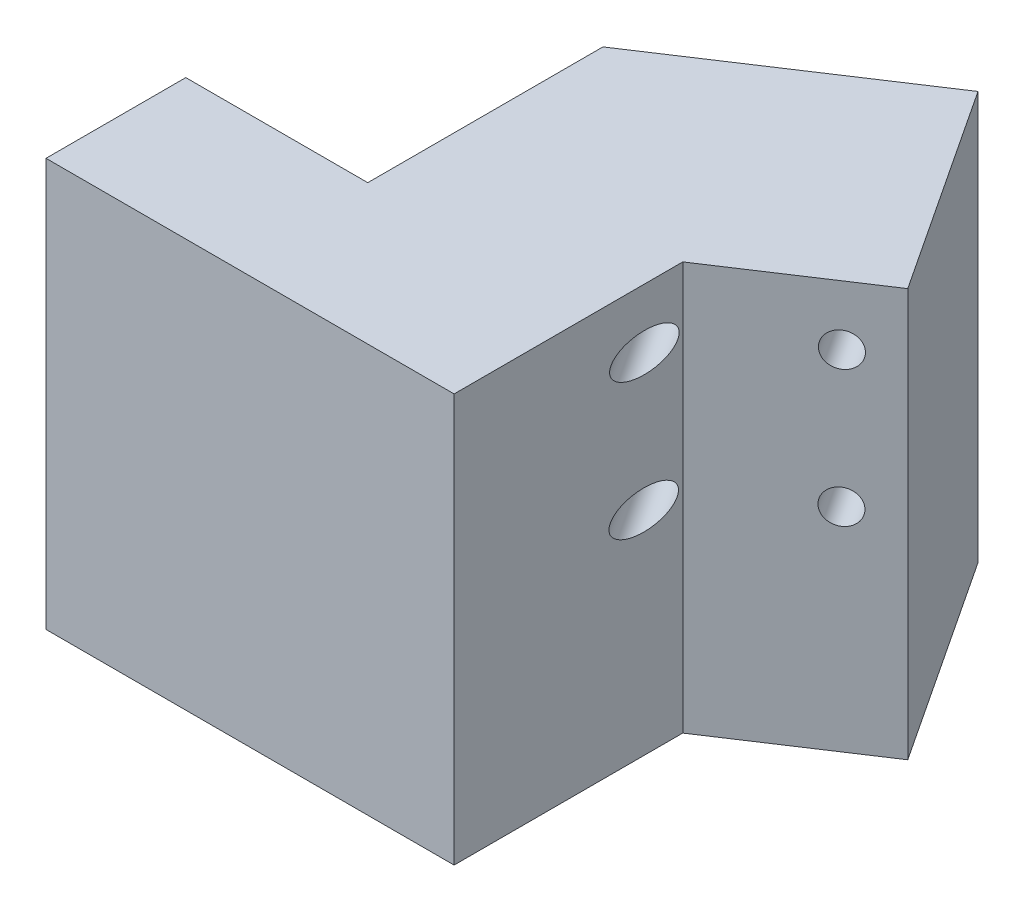
ISO-10303-21;
HEADER;
FILE_DESCRIPTION(('STEP AP214'),'2;1');
FILE_NAME('part.step','',(''),(''),'','','');
FILE_SCHEMA(('AUTOMOTIVE_DESIGN { 1 0 10303 214 1 1 1 1 }'));
ENDSEC;
DATA;
#1=APPLICATION_CONTEXT('core data for automotive mechanical design processes');
#2=APPLICATION_PROTOCOL_DEFINITION('international standard','automotive_design',2000,#1);
#3=PRODUCT_CONTEXT('',#1,'mechanical');
#4=PRODUCT('Part','Part','',(#3));
#5=PRODUCT_RELATED_PRODUCT_CATEGORY('part','',(#4));
#6=PRODUCT_DEFINITION_FORMATION('','',#4);
#7=PRODUCT_DEFINITION_CONTEXT('part definition',#1,'design');
#8=PRODUCT_DEFINITION('design','',#6,#7);
#9=PRODUCT_DEFINITION_SHAPE('','',#8);
#10=(LENGTH_UNIT() NAMED_UNIT(*) SI_UNIT(.MILLI.,.METRE.));
#11=(NAMED_UNIT(*) PLANE_ANGLE_UNIT() SI_UNIT($,.RADIAN.));
#12=(NAMED_UNIT(*) SI_UNIT($,.STERADIAN.) SOLID_ANGLE_UNIT());
#13=UNCERTAINTY_MEASURE_WITH_UNIT(LENGTH_MEASURE(1.E-05),#10,'distance_accuracy_value','');
#14=(GEOMETRIC_REPRESENTATION_CONTEXT(3) GLOBAL_UNCERTAINTY_ASSIGNED_CONTEXT((#13)) GLOBAL_UNIT_ASSIGNED_CONTEXT((#10,
#11,#12)) REPRESENTATION_CONTEXT('',''));
#15=CARTESIAN_POINT('',(0.,0.,0.));
#16=DIRECTION('',(0.,0.,1.));
#17=DIRECTION('',(1.,0.,0.));
#18=AXIS2_PLACEMENT_3D('',#15,#16,#17);
#19=CARTESIAN_POINT('',(48.006,48.,0.));
#20=DIRECTION('',(-1.,0.,0.));
#21=DIRECTION('',(0.,0.,1.));
#22=AXIS2_PLACEMENT_3D('',#19,#20,#21);
#23=PLANE('',#22);
#24=CARTESIAN_POINT('',(48.006,25.0191727680053,7.69527627987605));
#25=DIRECTION('',(-1.,0.,0.));
#26=DIRECTION('',(0.,0.,-1.));
#27=AXIS2_PLACEMENT_3D('',#24,#25,#26);
#28=ELLIPSE('',#27,4.08993500561602,2.25);
#29=CARTESIAN_POINT('',(48.006,25.0191727680053,3.60534127426003));
#30=VERTEX_POINT('',#29);
#31=EDGE_CURVE('E169',#30,#30,#28,.T.);
#32=ORIENTED_EDGE('',*,*,#31,.T.);
#33=EDGE_LOOP('',(#32));
#34=FACE_BOUND('',#33,.T.);
#35=CARTESIAN_POINT('',(48.006,41.0209489272188,7.6223451128624));
#36=DIRECTION('',(-1.,0.,0.));
#37=DIRECTION('',(0.,0.,-1.));
#38=AXIS2_PLACEMENT_3D('',#35,#36,#37);
#39=ELLIPSE('',#38,4.08993500561602,2.25);
#40=CARTESIAN_POINT('',(48.006,41.0209489272188,3.53241010724638));
#41=VERTEX_POINT('',#40);
#42=EDGE_CURVE('E174',#41,#41,#39,.T.);
#43=ORIENTED_EDGE('',*,*,#42,.T.);
#44=EDGE_LOOP('',(#43));
#45=FACE_BOUND('',#44,.T.);
#46=DIRECTION('',(0.,0.,-1.));
#47=VECTOR('',#46,1.);
#48=CARTESIAN_POINT('',(48.006,0.,0.));
#49=LINE('',#48,#47);
#50=CARTESIAN_POINT('',(48.006,0.,30.));
#51=VERTEX_POINT('',#50);
#52=CARTESIAN_POINT('',(48.006,0.,3.10199820500802));
#53=VERTEX_POINT('',#52);
#54=EDGE_CURVE('E132',#51,#53,#49,.T.);
#55=ORIENTED_EDGE('',*,*,#54,.T.);
#56=DIRECTION('',(0.,1.,0.));
#57=VECTOR('',#56,1.);
#58=CARTESIAN_POINT('',(48.006,48.,3.10199820500803));
#59=LINE('',#58,#57);
#60=CARTESIAN_POINT('',(48.006,48.,3.10199820500802));
#61=VERTEX_POINT('',#60);
#62=EDGE_CURVE('E197',#53,#61,#59,.T.);
#63=ORIENTED_EDGE('',*,*,#62,.T.);
#64=DIRECTION('',(0.,0.,-1.));
#65=VECTOR('',#64,1.);
#66=CARTESIAN_POINT('',(48.006,48.,0.));
#67=LINE('',#66,#65);
#68=CARTESIAN_POINT('',(48.006,48.,30.));
#69=VERTEX_POINT('',#68);
#70=EDGE_CURVE('E135',#69,#61,#67,.T.);
#71=ORIENTED_EDGE('',*,*,#70,.F.);
#72=DIRECTION('',(0.,1.,0.));
#73=VECTOR('',#72,1.);
#74=CARTESIAN_POINT('',(48.006,0.,30.));
#75=LINE('',#74,#73);
#76=EDGE_CURVE('E125',#51,#69,#75,.T.);
#77=ORIENTED_EDGE('',*,*,#76,.F.);
#78=EDGE_LOOP('',(#55,#63,#71,#77));
#79=FACE_BOUND('',#78,.T.);
#80=ADVANCED_FACE('F35',(#34,#45,#79),#23,.F.);
#81=CARTESIAN_POINT('',(0.,48.,0.));
#82=DIRECTION('',(0.550130991546431,0.,0.835078374848817));
#83=DIRECTION('',(0.835078374848817,0.,-0.550130991546431));
#84=AXIS2_PLACEMENT_3D('',#81,#82,#83);
#85=PLANE('',#84);
#86=CARTESIAN_POINT('',(36.6241480711431,32.9790510727815,-24.1271711730877));
#87=DIRECTION('',(-0.550130991546431,0.,-0.835078374848817));
#88=DIRECTION('',(-0.835078374848817,0.,0.550130991546431));
#89=AXIS2_PLACEMENT_3D('',#86,#87,#88);
#90=CIRCLE('',#89,4.1);
#91=CARTESIAN_POINT('',(33.200326734263,32.9790510727815,-21.8716341077473));
#92=VERTEX_POINT('',#91);
#93=EDGE_CURVE('E165',#92,#92,#90,.T.);
#94=ORIENTED_EDGE('',*,*,#93,.F.);
#95=EDGE_LOOP('',(#94));
#96=FACE_BOUND('',#95,.T.);
#97=CARTESIAN_POINT('',(29.9755426002469,41.0209489272188,-19.747218308463));
#98=DIRECTION('',(-0.550130991546431,0.,-0.835078374848817));
#99=DIRECTION('',(-0.835078374848817,0.,0.550130991546431));
#100=AXIS2_PLACEMENT_3D('',#97,#98,#99);
#101=CIRCLE('',#100,2.25);
#102=CARTESIAN_POINT('',(28.096616256837,41.0209489272188,-18.5094235774835));
#103=VERTEX_POINT('',#102);
#104=EDGE_CURVE('E129',#103,#103,#101,.T.);
#105=ORIENTED_EDGE('',*,*,#104,.F.);
#106=EDGE_LOOP('',(#105));
#107=FACE_BOUND('',#106,.T.);
#108=CARTESIAN_POINT('',(29.9420378402032,25.0191727680053,-19.725146120487));
#109=DIRECTION('',(-0.550130991546431,0.,-0.835078374848817));
#110=DIRECTION('',(-0.835078374848817,0.,0.550130991546431));
#111=AXIS2_PLACEMENT_3D('',#108,#109,#110);
#112=CIRCLE('',#111,2.25);
#113=CARTESIAN_POINT('',(28.0631114967933,25.0191727680053,-18.4873513895075));
#114=VERTEX_POINT('',#113);
#115=EDGE_CURVE('E123',#114,#114,#112,.T.);
#116=ORIENTED_EDGE('',*,*,#115,.F.);
#117=EDGE_LOOP('',(#116));
#118=FACE_BOUND('',#117,.T.);
#119=DIRECTION('',(-0.835078374848817,0.,0.550130991546431));
#120=VECTOR('',#119,1.);
#121=CARTESIAN_POINT('',(0.,0.,0.));
#122=LINE('',#121,#120);
#123=CARTESIAN_POINT('',(48.006,0.,-31.6252811419757));
#124=VERTEX_POINT('',#123);
#125=CARTESIAN_POINT('',(21.4077903056441,0.,-14.1029743582981));
#126=VERTEX_POINT('',#125);
#127=EDGE_CURVE('E139',#124,#126,#122,.T.);
#128=ORIENTED_EDGE('',*,*,#127,.T.);
#129=DIRECTION('',(0.,1.,0.));
#130=VECTOR('',#129,1.);
#131=CARTESIAN_POINT('',(21.4077903056441,-2.,-14.1029743582981));
#132=LINE('',#131,#130);
#133=CARTESIAN_POINT('',(21.4077903056441,48.,-14.1029743582981));
#134=VERTEX_POINT('',#133);
#135=EDGE_CURVE('E159',#126,#134,#132,.T.);
#136=ORIENTED_EDGE('',*,*,#135,.T.);
#137=DIRECTION('',(-0.835078374848817,0.,0.550130991546431));
#138=VECTOR('',#137,1.);
#139=CARTESIAN_POINT('',(0.,48.,0.));
#140=LINE('',#139,#138);
#141=CARTESIAN_POINT('',(48.006,48.,-31.6252811419756));
#142=VERTEX_POINT('',#141);
#143=EDGE_CURVE('E138',#142,#134,#140,.T.);
#144=ORIENTED_EDGE('',*,*,#143,.F.);
#145=DIRECTION('',(0.,-1.,0.));
#146=VECTOR('',#145,1.);
#147=CARTESIAN_POINT('',(48.006,48.,-31.6252811419757));
#148=LINE('',#147,#146);
#149=EDGE_CURVE('E107',#142,#124,#148,.T.);
#150=ORIENTED_EDGE('',*,*,#149,.T.);
#151=EDGE_LOOP('',(#128,#136,#144,#150));
#152=FACE_BOUND('',#151,.T.);
#153=CARTESIAN_POINT('',(43.3382798299774,40.9808272319949,-28.5502912934351));
#154=DIRECTION('',(-0.550130991546431,0.,-0.835078374848817));
#155=DIRECTION('',(-0.835078374848817,0.,0.550130991546431));
#156=AXIS2_PLACEMENT_3D('',#153,#154,#155);
#157=CIRCLE('',#156,2.);
#158=CARTESIAN_POINT('',(41.6681230802797,40.9808272319949,-27.4500293103423));
#159=VERTEX_POINT('',#158);
#160=EDGE_CURVE('E177',#159,#159,#157,.T.);
#161=ORIENTED_EDGE('',*,*,#160,.F.);
#162=EDGE_LOOP('',(#161));
#163=FACE_BOUND('',#162,.T.);
#164=CARTESIAN_POINT('',(43.3047750699337,24.9790510727815,-28.5282191054591));
#165=DIRECTION('',(-0.550130991546431,0.,-0.835078374848817));
#166=DIRECTION('',(-0.835078374848817,0.,0.550130991546431));
#167=AXIS2_PLACEMENT_3D('',#164,#165,#166);
#168=CIRCLE('',#167,2.00000000000001);
#169=CARTESIAN_POINT('',(41.634618320236,24.9790510727815,-27.4279571223663));
#170=VERTEX_POINT('',#169);
#171=EDGE_CURVE('E181',#170,#170,#168,.T.);
#172=ORIENTED_EDGE('',*,*,#171,.F.);
#173=EDGE_LOOP('',(#172));
#174=FACE_BOUND('',#173,.T.);
#175=ADVANCED_FACE('F148',(#96,#107,#118,#152,#163,#174),#85,.F.);
#176=CARTESIAN_POINT('',(0.,48.,0.));
#177=DIRECTION('',(0.,1.,0.));
#178=DIRECTION('',(0.,0.,1.));
#179=AXIS2_PLACEMENT_3D('',#176,#177,#178);
#180=PLANE('',#179);
#181=DIRECTION('',(0.,0.,-1.));
#182=VECTOR('',#181,1.);
#183=CARTESIAN_POINT('',(21.4077903056441,48.,-14.1029743582981));
#184=LINE('',#183,#182);
#185=CARTESIAN_POINT('',(21.4077903056441,48.,13.5575574435444));
#186=VERTEX_POINT('',#185);
#187=EDGE_CURVE('E115',#186,#134,#184,.T.);
#188=ORIENTED_EDGE('',*,*,#187,.F.);
#189=DIRECTION('',(1.,0.,0.));
#190=VECTOR('',#189,1.);
#191=CARTESIAN_POINT('',(21.4077903056441,48.,13.5575574435444));
#192=LINE('',#191,#190);
#193=CARTESIAN_POINT('',(0.,48.,13.5575574435444));
#194=VERTEX_POINT('',#193);
#195=EDGE_CURVE('E101',#194,#186,#192,.T.);
#196=ORIENTED_EDGE('',*,*,#195,.F.);
#197=DIRECTION('',(0.,0.,-1.));
#198=VECTOR('',#197,1.);
#199=CARTESIAN_POINT('',(0.,48.,30.));
#200=LINE('',#199,#198);
#201=CARTESIAN_POINT('',(0.,48.,30.));
#202=VERTEX_POINT('',#201);
#203=EDGE_CURVE('E112',#202,#194,#200,.T.);
#204=ORIENTED_EDGE('',*,*,#203,.F.);
#205=DIRECTION('',(-1.,0.,0.));
#206=VECTOR('',#205,1.);
#207=CARTESIAN_POINT('',(0.,48.,30.));
#208=LINE('',#207,#206);
#209=EDGE_CURVE('E121',#69,#202,#208,.T.);
#210=ORIENTED_EDGE('',*,*,#209,.F.);
#211=ORIENTED_EDGE('',*,*,#70,.T.);
#212=DIRECTION('',(0.835078374848817,0.,-0.550130991546431));
#213=VECTOR('',#212,1.);
#214=CARTESIAN_POINT('',(63.9597987548465,48.,-7.40800827135996));
#215=LINE('',#214,#213);
#216=CARTESIAN_POINT('',(63.9597987548465,48.,-7.40800827135996));
#217=VERTEX_POINT('',#216);
#218=EDGE_CURVE('E193',#61,#217,#215,.T.);
#219=ORIENTED_EDGE('',*,*,#218,.T.);
#220=DIRECTION('',(-0.550130991546431,0.,-0.835078374848817));
#221=VECTOR('',#220,1.);
#222=CARTESIAN_POINT('',(63.9597987548465,48.,-7.40800827135996));
#223=LINE('',#222,#221);
#224=EDGE_CURVE('E195',#217,#142,#223,.T.);
#225=ORIENTED_EDGE('',*,*,#224,.T.);
#226=ORIENTED_EDGE('',*,*,#143,.T.);
#227=EDGE_LOOP('',(#188,#196,#204,#210,#211,#219,#225,#226));
#228=FACE_BOUND('',#227,.T.);
#229=ADVANCED_FACE('F110',(#228),#180,.T.);
#230=CARTESIAN_POINT('',(0.,0.,0.));
#231=DIRECTION('',(0.,1.,0.));
#232=DIRECTION('',(0.,0.,1.));
#233=AXIS2_PLACEMENT_3D('',#230,#231,#232);
#234=PLANE('',#233);
#235=DIRECTION('',(1.,0.,0.));
#236=VECTOR('',#235,1.);
#237=CARTESIAN_POINT('',(0.,0.,13.5575574435444));
#238=LINE('',#237,#236);
#239=CARTESIAN_POINT('',(0.,0.,13.5575574435444));
#240=VERTEX_POINT('',#239);
#241=CARTESIAN_POINT('',(21.4077903056441,0.,13.5575574435444));
#242=VERTEX_POINT('',#241);
#243=EDGE_CURVE('E49',#240,#242,#238,.T.);
#244=ORIENTED_EDGE('',*,*,#243,.T.);
#245=DIRECTION('',(0.,0.,-1.));
#246=VECTOR('',#245,1.);
#247=CARTESIAN_POINT('',(21.4077903056441,0.,0.));
#248=LINE('',#247,#246);
#249=EDGE_CURVE('E11',#242,#126,#248,.T.);
#250=ORIENTED_EDGE('',*,*,#249,.T.);
#251=ORIENTED_EDGE('',*,*,#127,.F.);
#252=DIRECTION('',(-0.550130991546431,0.,-0.835078374848817));
#253=VECTOR('',#252,1.);
#254=CARTESIAN_POINT('',(63.9597987548465,0.,-7.40800827135996));
#255=LINE('',#254,#253);
#256=CARTESIAN_POINT('',(63.9597987548465,0.,-7.40800827135996));
#257=VERTEX_POINT('',#256);
#258=EDGE_CURVE('E57',#257,#124,#255,.T.);
#259=ORIENTED_EDGE('',*,*,#258,.F.);
#260=DIRECTION('',(-0.835078374848817,0.,0.550130991546431));
#261=VECTOR('',#260,1.);
#262=CARTESIAN_POINT('',(63.9597987548465,0.,-7.40800827135996));
#263=LINE('',#262,#261);
#264=EDGE_CURVE('E191',#257,#53,#263,.T.);
#265=ORIENTED_EDGE('',*,*,#264,.T.);
#266=ORIENTED_EDGE('',*,*,#54,.F.);
#267=DIRECTION('',(1.,0.,0.));
#268=VECTOR('',#267,1.);
#269=CARTESIAN_POINT('',(0.,0.,30.));
#270=LINE('',#269,#268);
#271=CARTESIAN_POINT('',(0.,0.,30.));
#272=VERTEX_POINT('',#271);
#273=EDGE_CURVE('E202',#272,#51,#270,.T.);
#274=ORIENTED_EDGE('',*,*,#273,.F.);
#275=DIRECTION('',(0.,0.,-1.));
#276=VECTOR('',#275,1.);
#277=CARTESIAN_POINT('',(0.,0.,30.));
#278=LINE('',#277,#276);
#279=EDGE_CURVE('E120',#272,#240,#278,.T.);
#280=ORIENTED_EDGE('',*,*,#279,.T.);
#281=EDGE_LOOP('',(#244,#250,#251,#259,#265,#266,#274,#280));
#282=FACE_BOUND('',#281,.T.);
#283=ADVANCED_FACE('F153',(#282),#234,.F.);
#284=CARTESIAN_POINT('',(57.4820921775684,41.0209489272188,22.0067004339778));
#285=DIRECTION('',(-0.550130991546431,0.,-0.835078374848817));
#286=DIRECTION('',(-0.835078374848817,0.,0.550130991546431));
#287=AXIS2_PLACEMENT_3D('',#284,#285,#286);
#288=CYLINDRICAL_SURFACE('',#287,2.25);
#289=ORIENTED_EDGE('',*,*,#104,.T.);
#290=EDGE_LOOP('',(#289));
#291=FACE_BOUND('',#290,.T.);
#292=ORIENTED_EDGE('',*,*,#42,.F.);
#293=EDGE_LOOP('',(#292));
#294=FACE_BOUND('',#293,.T.);
#295=ADVANCED_FACE('F236',(#291,#294),#288,.F.);
#296=CARTESIAN_POINT('',(57.4485874175247,25.0191727680053,22.0287726219539));
#297=DIRECTION('',(-0.550130991546431,0.,-0.835078374848817));
#298=DIRECTION('',(-0.835078374848817,0.,0.550130991546431));
#299=AXIS2_PLACEMENT_3D('',#296,#297,#298);
#300=CYLINDRICAL_SURFACE('',#299,2.25);
#301=ORIENTED_EDGE('',*,*,#115,.T.);
#302=EDGE_LOOP('',(#301));
#303=FACE_BOUND('',#302,.T.);
#304=ORIENTED_EDGE('',*,*,#31,.F.);
#305=EDGE_LOOP('',(#304));
#306=FACE_BOUND('',#305,.T.);
#307=ADVANCED_FACE('F238',(#303,#306),#300,.F.);
#308=CARTESIAN_POINT('',(0.,0.,30.));
#309=DIRECTION('',(1.,0.,0.));
#310=DIRECTION('',(0.,0.,-1.));
#311=AXIS2_PLACEMENT_3D('',#308,#309,#310);
#312=PLANE('',#311);
#313=ORIENTED_EDGE('',*,*,#203,.T.);
#314=DIRECTION('',(0.,-1.,0.));
#315=VECTOR('',#314,1.);
#316=CARTESIAN_POINT('',(0.,0.,13.5575574435444));
#317=LINE('',#316,#315);
#318=EDGE_CURVE('E42',#194,#240,#317,.T.);
#319=ORIENTED_EDGE('',*,*,#318,.T.);
#320=ORIENTED_EDGE('',*,*,#279,.F.);
#321=DIRECTION('',(0.,-1.,0.));
#322=VECTOR('',#321,1.);
#323=CARTESIAN_POINT('',(0.,0.,30.));
#324=LINE('',#323,#322);
#325=EDGE_CURVE('E119',#202,#272,#324,.T.);
#326=ORIENTED_EDGE('',*,*,#325,.F.);
#327=EDGE_LOOP('',(#313,#319,#320,#326));
#328=FACE_BOUND('',#327,.T.);
#329=ADVANCED_FACE('F117',(#328),#312,.F.);
#330=CARTESIAN_POINT('',(0.,0.,30.));
#331=DIRECTION('',(0.,0.,-1.));
#332=DIRECTION('',(-1.,0.,0.));
#333=AXIS2_PLACEMENT_3D('',#330,#331,#332);
#334=PLANE('',#333);
#335=ORIENTED_EDGE('',*,*,#325,.T.);
#336=ORIENTED_EDGE('',*,*,#273,.T.);
#337=ORIENTED_EDGE('',*,*,#76,.T.);
#338=ORIENTED_EDGE('',*,*,#209,.T.);
#339=EDGE_LOOP('',(#335,#336,#337,#338));
#340=FACE_BOUND('',#339,.T.);
#341=ADVANCED_FACE('F207',(#340),#334,.F.);
#342=CARTESIAN_POINT('',(15.9537987548465,0.,24.2172728706157));
#343=DIRECTION('',(0.550130991546431,0.,0.835078374848817));
#344=DIRECTION('',(0.835078374848817,0.,-0.550130991546431));
#345=AXIS2_PLACEMENT_3D('',#342,#343,#344);
#346=PLANE('',#345);
#347=CARTESIAN_POINT('',(59.2585738247802,24.9790510727815,-4.31094623484344));
#348=DIRECTION('',(-0.550130991546431,0.,-0.835078374848817));
#349=DIRECTION('',(-0.835078374848817,0.,0.550130991546431));
#350=AXIS2_PLACEMENT_3D('',#347,#348,#349);
#351=CIRCLE('',#350,2.00000000000001);
#352=CARTESIAN_POINT('',(57.5884170750825,24.9790510727815,-3.21068425175057));
#353=VERTEX_POINT('',#352);
#354=EDGE_CURVE('E184',#353,#353,#351,.T.);
#355=ORIENTED_EDGE('',*,*,#354,.T.);
#356=EDGE_LOOP('',(#355));
#357=FACE_BOUND('',#356,.T.);
#358=CARTESIAN_POINT('',(59.2920785848239,40.9808272319949,-4.33301842281946));
#359=DIRECTION('',(-0.550130991546431,0.,-0.835078374848817));
#360=DIRECTION('',(-0.835078374848817,0.,0.550130991546431));
#361=AXIS2_PLACEMENT_3D('',#358,#359,#360);
#362=CIRCLE('',#361,2.);
#363=CARTESIAN_POINT('',(57.6219218351262,40.9808272319949,-3.2327564397266));
#364=VERTEX_POINT('',#363);
#365=EDGE_CURVE('E178',#364,#364,#362,.T.);
#366=ORIENTED_EDGE('',*,*,#365,.T.);
#367=EDGE_LOOP('',(#366));
#368=FACE_BOUND('',#367,.T.);
#369=ORIENTED_EDGE('',*,*,#62,.F.);
#370=ORIENTED_EDGE('',*,*,#264,.F.);
#371=DIRECTION('',(0.,-1.,0.));
#372=VECTOR('',#371,1.);
#373=CARTESIAN_POINT('',(63.9597987548465,0.,-7.40800827135996));
#374=LINE('',#373,#372);
#375=EDGE_CURVE('E187',#217,#257,#374,.T.);
#376=ORIENTED_EDGE('',*,*,#375,.F.);
#377=ORIENTED_EDGE('',*,*,#218,.F.);
#378=EDGE_LOOP('',(#369,#370,#376,#377));
#379=FACE_BOUND('',#378,.T.);
#380=ADVANCED_FACE('F210',(#357,#368,#379),#346,.T.);
#381=CARTESIAN_POINT('',(63.9597987548465,0.,-7.40800827135996));
#382=DIRECTION('',(0.835078374848817,0.,-0.550130991546431));
#383=DIRECTION('',(-0.550130991546431,0.,-0.835078374848817));
#384=AXIS2_PLACEMENT_3D('',#381,#382,#383);
#385=PLANE('',#384);
#386=ORIENTED_EDGE('',*,*,#149,.F.);
#387=ORIENTED_EDGE('',*,*,#224,.F.);
#388=ORIENTED_EDGE('',*,*,#375,.T.);
#389=ORIENTED_EDGE('',*,*,#258,.T.);
#390=EDGE_LOOP('',(#386,#387,#388,#389));
#391=FACE_BOUND('',#390,.T.);
#392=ADVANCED_FACE('F212',(#391),#385,.T.);
#393=CARTESIAN_POINT('',(59.2585738247802,24.9790510727815,-4.31094623484344));
#394=DIRECTION('',(-0.550130991546431,0.,-0.835078374848817));
#395=DIRECTION('',(-0.835078374848817,0.,0.550130991546431));
#396=AXIS2_PLACEMENT_3D('',#393,#394,#395);
#397=CYLINDRICAL_SURFACE('',#396,2.00000000000001);
#398=ORIENTED_EDGE('',*,*,#354,.F.);
#399=EDGE_LOOP('',(#398));
#400=FACE_BOUND('',#399,.T.);
#401=ORIENTED_EDGE('',*,*,#171,.T.);
#402=EDGE_LOOP('',(#401));
#403=FACE_BOUND('',#402,.T.);
#404=ADVANCED_FACE('F214',(#400,#403),#397,.F.);
#405=CARTESIAN_POINT('',(59.2920785848239,40.9808272319949,-4.33301842281946));
#406=DIRECTION('',(-0.550130991546431,0.,-0.835078374848817));
#407=DIRECTION('',(-0.835078374848817,0.,0.550130991546431));
#408=AXIS2_PLACEMENT_3D('',#405,#406,#407);
#409=CYLINDRICAL_SURFACE('',#408,2.);
#410=ORIENTED_EDGE('',*,*,#365,.F.);
#411=EDGE_LOOP('',(#410));
#412=FACE_BOUND('',#411,.T.);
#413=ORIENTED_EDGE('',*,*,#160,.T.);
#414=EDGE_LOOP('',(#413));
#415=FACE_BOUND('',#414,.T.);
#416=ADVANCED_FACE('F220',(#412,#415),#409,.F.);
#417=CARTESIAN_POINT('',(40.4750650119682,32.9790510727815,-18.281622549146));
#418=DIRECTION('',(-0.550130991546431,0.,-0.835078374848817));
#419=DIRECTION('',(-0.835078374848817,0.,0.550130991546431));
#420=AXIS2_PLACEMENT_3D('',#417,#418,#419);
#421=CYLINDRICAL_SURFACE('',#420,4.1);
#422=CARTESIAN_POINT('',(40.4750650119682,32.9790510727815,-18.281622549146));
#423=DIRECTION('',(-0.550130991546431,0.,-0.835078374848817));
#424=DIRECTION('',(-0.835078374848817,0.,0.550130991546431));
#425=AXIS2_PLACEMENT_3D('',#422,#423,#424);
#426=CIRCLE('',#425,4.1);
#427=CARTESIAN_POINT('',(37.051243675088,32.9790510727815,-16.0260854838056));
#428=VERTEX_POINT('',#427);
#429=EDGE_CURVE('E166',#428,#428,#426,.T.);
#430=ORIENTED_EDGE('',*,*,#429,.F.);
#431=EDGE_LOOP('',(#430));
#432=FACE_BOUND('',#431,.T.);
#433=ORIENTED_EDGE('',*,*,#93,.T.);
#434=EDGE_LOOP('',(#433));
#435=FACE_BOUND('',#434,.T.);
#436=ADVANCED_FACE('F295',(#432,#435),#421,.F.);
#437=CARTESIAN_POINT('',(40.4750650119682,32.9790510727815,-18.281622549146));
#438=DIRECTION('',(-0.550130991546431,0.,-0.835078374848817));
#439=DIRECTION('',(-0.835078374848817,0.,0.550130991546431));
#440=AXIS2_PLACEMENT_3D('',#437,#438,#439);
#441=PLANE('',#440);
#442=ORIENTED_EDGE('',*,*,#429,.T.);
#443=EDGE_LOOP('',(#442));
#444=FACE_BOUND('',#443,.T.);
#445=ADVANCED_FACE('F279',(#444),#441,.T.);
#446=CARTESIAN_POINT('',(21.4077903056441,-2.,-14.1029743582981));
#447=DIRECTION('',(1.,0.,0.));
#448=DIRECTION('',(0.,0.,-1.));
#449=AXIS2_PLACEMENT_3D('',#446,#447,#448);
#450=PLANE('',#449);
#451=DIRECTION('',(0.,1.,0.));
#452=VECTOR('',#451,1.);
#453=CARTESIAN_POINT('',(21.4077903056441,-2.,13.5575574435444));
#454=LINE('',#453,#452);
#455=EDGE_CURVE('E158',#242,#186,#454,.T.);
#456=ORIENTED_EDGE('',*,*,#455,.T.);
#457=ORIENTED_EDGE('',*,*,#187,.T.);
#458=ORIENTED_EDGE('',*,*,#135,.F.);
#459=ORIENTED_EDGE('',*,*,#249,.F.);
#460=EDGE_LOOP('',(#456,#457,#458,#459));
#461=FACE_BOUND('',#460,.T.);
#462=ADVANCED_FACE('F157',(#461),#450,.F.);
#463=CARTESIAN_POINT('',(21.4077903056441,-2.,13.5575574435444));
#464=DIRECTION('',(0.,0.,1.));
#465=DIRECTION('',(1.,0.,0.));
#466=AXIS2_PLACEMENT_3D('',#463,#464,#465);
#467=PLANE('',#466);
#468=ORIENTED_EDGE('',*,*,#318,.F.);
#469=ORIENTED_EDGE('',*,*,#195,.T.);
#470=ORIENTED_EDGE('',*,*,#455,.F.);
#471=ORIENTED_EDGE('',*,*,#243,.F.);
#472=EDGE_LOOP('',(#468,#469,#470,#471));
#473=FACE_BOUND('',#472,.T.);
#474=ADVANCED_FACE('F100',(#473),#467,.F.);
#475=CLOSED_SHELL('',(#80,#175,#229,#283,#295,#307,#329,#341,#380,#392,#404,#416,#436,#445,#462,#474));
#476=MANIFOLD_SOLID_BREP('B2',#475);
#477=ADVANCED_BREP_SHAPE_REPRESENTATION('',(#18,#476),#14);
#478=SHAPE_DEFINITION_REPRESENTATION(#9,#477);
ENDSEC;
END-ISO-10303-21;
